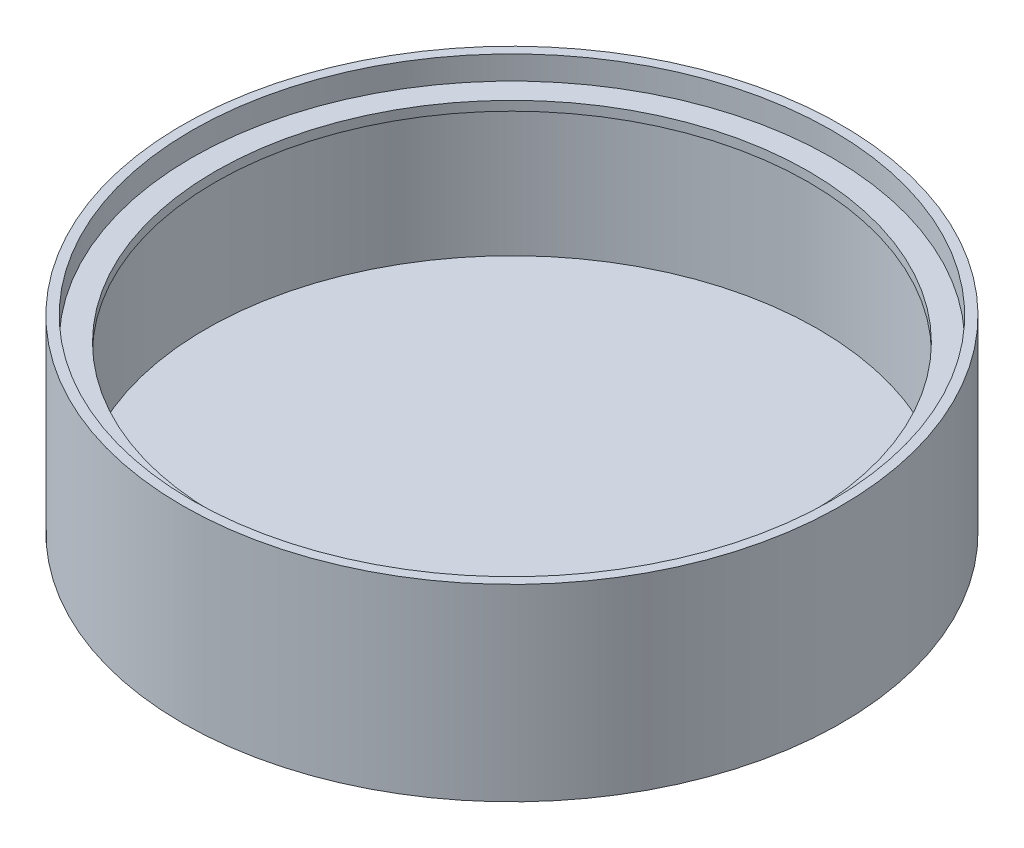
ISO-10303-21;
HEADER;
FILE_DESCRIPTION(('STEP AP214'),'2;1');
FILE_NAME('part.step','',(''),(''),'','','');
FILE_SCHEMA(('AUTOMOTIVE_DESIGN { 1 0 10303 214 1 1 1 1 }'));
ENDSEC;
DATA;
#1=APPLICATION_CONTEXT('core data for automotive mechanical design processes');
#2=APPLICATION_PROTOCOL_DEFINITION('international standard','automotive_design',2000,#1);
#3=PRODUCT_CONTEXT('',#1,'mechanical');
#4=PRODUCT('Part','Part','',(#3));
#5=PRODUCT_RELATED_PRODUCT_CATEGORY('part','',(#4));
#6=PRODUCT_DEFINITION_FORMATION('','',#4);
#7=PRODUCT_DEFINITION_CONTEXT('part definition',#1,'design');
#8=PRODUCT_DEFINITION('design','',#6,#7);
#9=PRODUCT_DEFINITION_SHAPE('','',#8);
#10=(LENGTH_UNIT() NAMED_UNIT(*) SI_UNIT(.MILLI.,.METRE.));
#11=(NAMED_UNIT(*) PLANE_ANGLE_UNIT() SI_UNIT($,.RADIAN.));
#12=(NAMED_UNIT(*) SI_UNIT($,.STERADIAN.) SOLID_ANGLE_UNIT());
#13=UNCERTAINTY_MEASURE_WITH_UNIT(LENGTH_MEASURE(1.E-05),#10,'distance_accuracy_value','');
#14=(GEOMETRIC_REPRESENTATION_CONTEXT(3) GLOBAL_UNCERTAINTY_ASSIGNED_CONTEXT((#13)) GLOBAL_UNIT_ASSIGNED_CONTEXT((#10,
#11,#12)) REPRESENTATION_CONTEXT('',''));
#15=CARTESIAN_POINT('',(0.,0.,0.));
#16=DIRECTION('',(0.,0.,1.));
#17=DIRECTION('',(1.,0.,0.));
#18=AXIS2_PLACEMENT_3D('',#15,#16,#17);
#19=CARTESIAN_POINT('',(0.,40.,0.));
#20=DIRECTION('',(0.,-1.,0.));
#21=DIRECTION('',(0.,0.,-1.));
#22=AXIS2_PLACEMENT_3D('',#19,#20,#21);
#23=CYLINDRICAL_SURFACE('',#22,70.);
#24=CARTESIAN_POINT('',(0.,40.,0.));
#25=DIRECTION('',(0.,1.,0.));
#26=DIRECTION('',(0.,0.,1.));
#27=AXIS2_PLACEMENT_3D('',#24,#25,#26);
#28=CIRCLE('',#27,70.);
#29=CARTESIAN_POINT('',(0.,40.,70.));
#30=VERTEX_POINT('',#29);
#31=EDGE_CURVE('E10',#30,#30,#28,.T.);
#32=ORIENTED_EDGE('',*,*,#31,.F.);
#33=EDGE_LOOP('',(#32));
#34=FACE_BOUND('',#33,.T.);
#35=CARTESIAN_POINT('',(0.,0.,0.));
#36=DIRECTION('',(0.,1.,0.));
#37=DIRECTION('',(0.,0.,1.));
#38=AXIS2_PLACEMENT_3D('',#35,#36,#37);
#39=CIRCLE('',#38,70.);
#40=CARTESIAN_POINT('',(0.,0.,70.));
#41=VERTEX_POINT('',#40);
#42=EDGE_CURVE('E37',#41,#41,#39,.T.);
#43=ORIENTED_EDGE('',*,*,#42,.T.);
#44=EDGE_LOOP('',(#43));
#45=FACE_BOUND('',#44,.T.);
#46=ADVANCED_FACE('F30',(#34,#45),#23,.T.);
#47=CARTESIAN_POINT('',(0.,40.,0.));
#48=DIRECTION('',(0.,1.,0.));
#49=DIRECTION('',(0.,0.,1.));
#50=AXIS2_PLACEMENT_3D('',#47,#48,#49);
#51=PLANE('',#50);
#52=CARTESIAN_POINT('',(0.,40.,0.));
#53=DIRECTION('',(0.,1.,0.));
#54=DIRECTION('',(0.,0.,1.));
#55=AXIS2_PLACEMENT_3D('',#52,#53,#54);
#56=CIRCLE('',#55,68.);
#57=CARTESIAN_POINT('',(0.,40.,68.));
#58=VERTEX_POINT('',#57);
#59=EDGE_CURVE('E45',#58,#58,#56,.T.);
#60=ORIENTED_EDGE('',*,*,#59,.F.);
#61=EDGE_LOOP('',(#60));
#62=FACE_BOUND('',#61,.T.);
#63=ORIENTED_EDGE('',*,*,#31,.T.);
#64=EDGE_LOOP('',(#63));
#65=FACE_BOUND('',#64,.T.);
#66=ADVANCED_FACE('F85',(#62,#65),#51,.T.);
#67=CARTESIAN_POINT('',(0.,0.,0.));
#68=DIRECTION('',(0.,1.,0.));
#69=DIRECTION('',(0.,0.,1.));
#70=AXIS2_PLACEMENT_3D('',#67,#68,#69);
#71=PLANE('',#70);
#72=ORIENTED_EDGE('',*,*,#42,.F.);
#73=EDGE_LOOP('',(#72));
#74=FACE_BOUND('',#73,.T.);
#75=ADVANCED_FACE('F90',(#74),#71,.F.);
#76=CARTESIAN_POINT('',(0.,35.,0.));
#77=DIRECTION('',(0.,1.,0.));
#78=DIRECTION('',(0.,0.,1.));
#79=AXIS2_PLACEMENT_3D('',#76,#77,#78);
#80=PLANE('',#79);
#81=CARTESIAN_POINT('',(0.,35.,0.));
#82=DIRECTION('',(0.,1.,0.));
#83=DIRECTION('',(0.,0.,1.));
#84=AXIS2_PLACEMENT_3D('',#81,#82,#83);
#85=CIRCLE('',#84,68.);
#86=CARTESIAN_POINT('',(0.,35.,68.));
#87=VERTEX_POINT('',#86);
#88=EDGE_CURVE('E48',#87,#87,#85,.T.);
#89=ORIENTED_EDGE('',*,*,#88,.T.);
#90=EDGE_LOOP('',(#89));
#91=FACE_BOUND('',#90,.T.);
#92=CARTESIAN_POINT('',(0.,35.,0.));
#93=DIRECTION('',(0.,1.,0.));
#94=DIRECTION('',(0.,0.,1.));
#95=AXIS2_PLACEMENT_3D('',#92,#93,#94);
#96=CIRCLE('',#95,63.);
#97=CARTESIAN_POINT('',(0.,35.,63.));
#98=VERTEX_POINT('',#97);
#99=EDGE_CURVE('E42',#98,#98,#96,.F.);
#100=ORIENTED_EDGE('',*,*,#99,.T.);
#101=EDGE_LOOP('',(#100));
#102=FACE_BOUND('',#101,.T.);
#103=ADVANCED_FACE('F97',(#91,#102),#80,.T.);
#104=CARTESIAN_POINT('',(0.,35.,0.));
#105=DIRECTION('',(0.,1.,0.));
#106=DIRECTION('',(0.,0.,1.));
#107=AXIS2_PLACEMENT_3D('',#104,#105,#106);
#108=CYLINDRICAL_SURFACE('',#107,68.);
#109=ORIENTED_EDGE('',*,*,#88,.F.);
#110=EDGE_LOOP('',(#109));
#111=FACE_BOUND('',#110,.T.);
#112=ORIENTED_EDGE('',*,*,#59,.T.);
#113=EDGE_LOOP('',(#112));
#114=FACE_BOUND('',#113,.T.);
#115=ADVANCED_FACE('F81',(#111,#114),#108,.F.);
#116=CARTESIAN_POINT('',(0.,5.,0.));
#117=DIRECTION('',(0.,1.,0.));
#118=DIRECTION('',(0.,0.,1.));
#119=AXIS2_PLACEMENT_3D('',#116,#117,#118);
#120=CYLINDRICAL_SURFACE('',#119,63.);
#121=CARTESIAN_POINT('',(0.,33.,0.));
#122=DIRECTION('',(0.,1.,0.));
#123=DIRECTION('',(0.,0.,1.));
#124=AXIS2_PLACEMENT_3D('',#121,#122,#123);
#125=CIRCLE('',#124,63.);
#126=CARTESIAN_POINT('',(0.,33.,63.));
#127=VERTEX_POINT('',#126);
#128=EDGE_CURVE('E33',#127,#127,#125,.F.);
#129=ORIENTED_EDGE('',*,*,#128,.T.);
#130=EDGE_LOOP('',(#129));
#131=FACE_BOUND('',#130,.T.);
#132=ORIENTED_EDGE('',*,*,#99,.F.);
#133=EDGE_LOOP('',(#132));
#134=FACE_BOUND('',#133,.T.);
#135=ADVANCED_FACE('F66',(#131,#134),#120,.F.);
#136=CARTESIAN_POINT('',(0.,33.,0.));
#137=DIRECTION('',(0.,1.,0.));
#138=DIRECTION('',(0.,0.,1.));
#139=AXIS2_PLACEMENT_3D('',#136,#137,#138);
#140=PLANE('',#139);
#141=CARTESIAN_POINT('',(0.,33.,0.));
#142=DIRECTION('',(0.,1.,0.));
#143=DIRECTION('',(0.,0.,1.));
#144=AXIS2_PLACEMENT_3D('',#141,#142,#143);
#145=CIRCLE('',#144,65.);
#146=CARTESIAN_POINT('',(0.,33.,65.));
#147=VERTEX_POINT('',#146);
#148=EDGE_CURVE('E56',#147,#147,#145,.T.);
#149=ORIENTED_EDGE('',*,*,#148,.F.);
#150=EDGE_LOOP('',(#149));
#151=FACE_BOUND('',#150,.T.);
#152=ORIENTED_EDGE('',*,*,#128,.F.);
#153=EDGE_LOOP('',(#152));
#154=FACE_BOUND('',#153,.T.);
#155=ADVANCED_FACE('F69',(#151,#154),#140,.F.);
#156=CARTESIAN_POINT('',(0.,5.,0.));
#157=DIRECTION('',(0.,1.,0.));
#158=DIRECTION('',(0.,0.,1.));
#159=AXIS2_PLACEMENT_3D('',#156,#157,#158);
#160=CYLINDRICAL_SURFACE('',#159,65.);
#161=CARTESIAN_POINT('',(0.,5.,0.));
#162=DIRECTION('',(0.,1.,0.));
#163=DIRECTION('',(0.,0.,1.));
#164=AXIS2_PLACEMENT_3D('',#161,#162,#163);
#165=CIRCLE('',#164,65.);
#166=CARTESIAN_POINT('',(0.,5.,65.));
#167=VERTEX_POINT('',#166);
#168=EDGE_CURVE('E59',#167,#167,#165,.T.);
#169=ORIENTED_EDGE('',*,*,#168,.F.);
#170=EDGE_LOOP('',(#169));
#171=FACE_BOUND('',#170,.T.);
#172=ORIENTED_EDGE('',*,*,#148,.T.);
#173=EDGE_LOOP('',(#172));
#174=FACE_BOUND('',#173,.T.);
#175=ADVANCED_FACE('F71',(#171,#174),#160,.F.);
#176=CARTESIAN_POINT('',(0.,5.,0.));
#177=DIRECTION('',(0.,1.,0.));
#178=DIRECTION('',(0.,0.,1.));
#179=AXIS2_PLACEMENT_3D('',#176,#177,#178);
#180=PLANE('',#179);
#181=ORIENTED_EDGE('',*,*,#168,.T.);
#182=EDGE_LOOP('',(#181));
#183=FACE_BOUND('',#182,.T.);
#184=ADVANCED_FACE('F78',(#183),#180,.T.);
#185=CLOSED_SHELL('',(#46,#66,#75,#103,#115,#135,#155,#175,#184));
#186=MANIFOLD_SOLID_BREP('B2',#185);
#187=ADVANCED_BREP_SHAPE_REPRESENTATION('',(#18,#186),#14);
#188=SHAPE_DEFINITION_REPRESENTATION(#9,#187);
ENDSEC;
END-ISO-10303-21;
